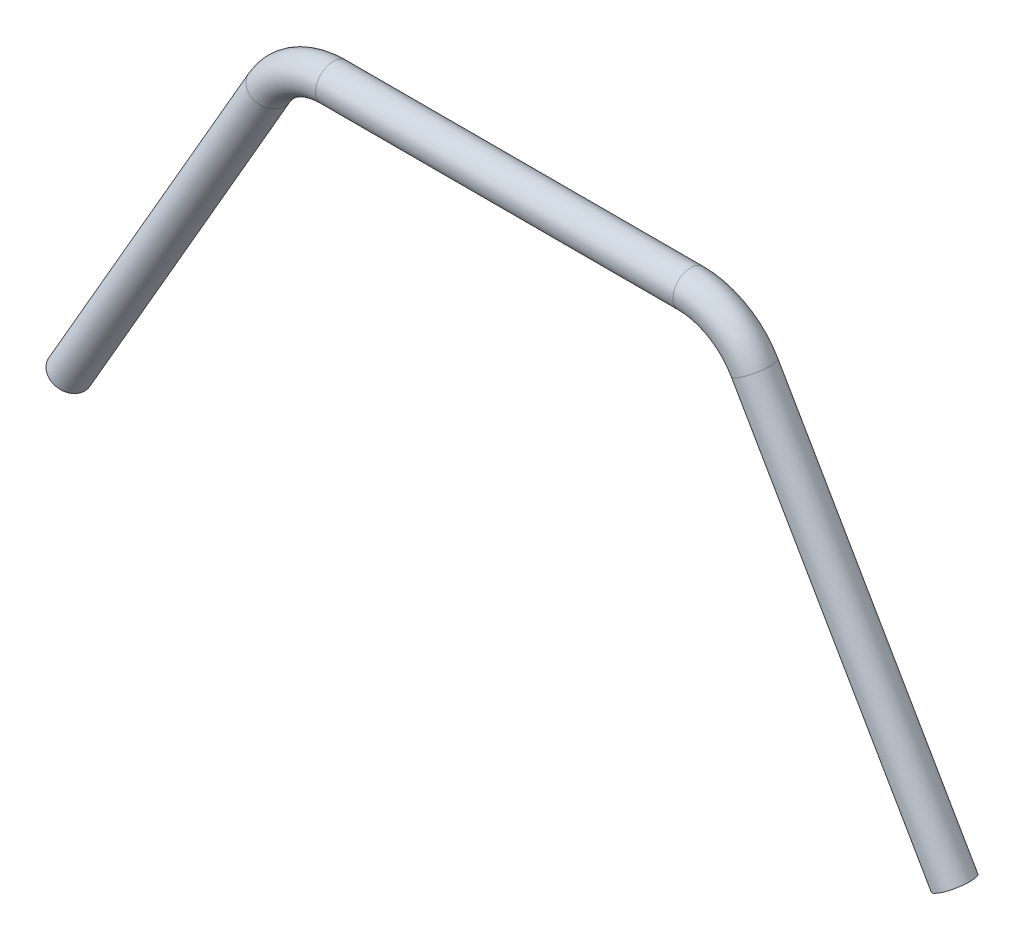
ISO-10303-21;
HEADER;
FILE_DESCRIPTION(('STEP AP214'),'2;1');
FILE_NAME('part.step','',(''),(''),'','','');
FILE_SCHEMA(('AUTOMOTIVE_DESIGN { 1 0 10303 214 1 1 1 1 }'));
ENDSEC;
DATA;
#1=APPLICATION_CONTEXT('core data for automotive mechanical design processes');
#2=APPLICATION_PROTOCOL_DEFINITION('international standard','automotive_design',2000,#1);
#3=PRODUCT_CONTEXT('',#1,'mechanical');
#4=PRODUCT('Part','Part','',(#3));
#5=PRODUCT_RELATED_PRODUCT_CATEGORY('part','',(#4));
#6=PRODUCT_DEFINITION_FORMATION('','',#4);
#7=PRODUCT_DEFINITION_CONTEXT('part definition',#1,'design');
#8=PRODUCT_DEFINITION('design','',#6,#7);
#9=PRODUCT_DEFINITION_SHAPE('','',#8);
#10=(LENGTH_UNIT() NAMED_UNIT(*) SI_UNIT(.MILLI.,.METRE.));
#11=(NAMED_UNIT(*) PLANE_ANGLE_UNIT() SI_UNIT($,.RADIAN.));
#12=(NAMED_UNIT(*) SI_UNIT($,.STERADIAN.) SOLID_ANGLE_UNIT());
#13=UNCERTAINTY_MEASURE_WITH_UNIT(LENGTH_MEASURE(1.E-05),#10,'distance_accuracy_value','');
#14=(GEOMETRIC_REPRESENTATION_CONTEXT(3) GLOBAL_UNCERTAINTY_ASSIGNED_CONTEXT((#13)) GLOBAL_UNIT_ASSIGNED_CONTEXT((#10,
#11,#12)) REPRESENTATION_CONTEXT('',''));
#15=CARTESIAN_POINT('',(0.,0.,0.));
#16=DIRECTION('',(0.,0.,1.));
#17=DIRECTION('',(1.,0.,0.));
#18=AXIS2_PLACEMENT_3D('',#15,#16,#17);
#19=CARTESIAN_POINT('',(150.,-135.903810567666,0.));
#20=DIRECTION('',(0.499999999999998,-0.86602540378444,0.));
#21=DIRECTION('',(0.,0.,-1.));
#22=AXIS2_PLACEMENT_3D('',#19,#20,#21);
#23=PLANE('',#22);
#24=CARTESIAN_POINT('',(150.,-135.903810567666,0.));
#25=DIRECTION('',(0.499999999999998,-0.86602540378444,0.));
#26=DIRECTION('',(0.,0.,-1.));
#27=AXIS2_PLACEMENT_3D('',#24,#25,#26);
#28=CIRCLE('',#27,6.);
#29=CARTESIAN_POINT('',(150.,-135.903810567666,-6.));
#30=VERTEX_POINT('',#29);
#31=EDGE_CURVE('E10',#30,#30,#28,.T.);
#32=ORIENTED_EDGE('',*,*,#31,.T.);
#33=EDGE_LOOP('',(#32));
#34=FACE_BOUND('',#33,.T.);
#35=ADVANCED_FACE('F36',(#34),#23,.T.);
#36=CARTESIAN_POINT('',(0.,-6.,0.));
#37=DIRECTION('',(1.,0.,0.));
#38=DIRECTION('',(0.,1.,0.));
#39=AXIS2_PLACEMENT_3D('',#36,#37,#38);
#40=CYLINDRICAL_SURFACE('',#39,6.);
#41=CARTESIAN_POINT('',(60.5662432702593,-6.,0.));
#42=DIRECTION('',(1.,0.,0.));
#43=DIRECTION('',(0.,0.,-1.));
#44=AXIS2_PLACEMENT_3D('',#41,#42,#43);
#45=CIRCLE('',#44,6.);
#46=CARTESIAN_POINT('',(60.5662432702593,0.,0.));
#47=VERTEX_POINT('',#46);
#48=EDGE_CURVE('E49',#47,#47,#45,.T.);
#49=ORIENTED_EDGE('',*,*,#48,.F.);
#50=EDGE_LOOP('',(#49));
#51=FACE_BOUND('',#50,.T.);
#52=CARTESIAN_POINT('',(-60.5662432702593,-6.,0.));
#53=DIRECTION('',(1.,0.,0.));
#54=DIRECTION('',(0.,0.,-1.));
#55=AXIS2_PLACEMENT_3D('',#52,#53,#54);
#56=CIRCLE('',#55,6.);
#57=CARTESIAN_POINT('',(-60.5662432702593,0.,0.));
#58=VERTEX_POINT('',#57);
#59=EDGE_CURVE('E65',#58,#58,#56,.F.);
#60=ORIENTED_EDGE('',*,*,#59,.F.);
#61=EDGE_LOOP('',(#60));
#62=FACE_BOUND('',#61,.T.);
#63=ADVANCED_FACE('F73',(#51,#62),#40,.T.);
#64=CARTESIAN_POINT('',(60.5662432702593,-31.,0.));
#65=DIRECTION('',(0.,0.,-1.));
#66=DIRECTION('',(-1.,0.,0.));
#67=AXIS2_PLACEMENT_3D('',#64,#65,#66);
#68=TOROIDAL_SURFACE('',#67,25.,6.);
#69=CARTESIAN_POINT('',(82.2168783648703,-18.5000000000001,0.));
#70=DIRECTION('',(0.499999999999998,-0.86602540378444,0.));
#71=DIRECTION('',(0.,0.,-1.));
#72=AXIS2_PLACEMENT_3D('',#69,#70,#71);
#73=CIRCLE('',#72,6.);
#74=CARTESIAN_POINT('',(87.413030787577,-15.5000000000001,0.));
#75=VERTEX_POINT('',#74);
#76=EDGE_CURVE('E43',#75,#75,#73,.T.);
#77=CARTESIAN_POINT('',(60.5662432702593,-31.,0.));
#78=DIRECTION('',(0.,0.,-1.));
#79=DIRECTION('',(-1.,0.,0.));
#80=AXIS2_PLACEMENT_3D('',#77,#78,#79);
#81=CIRCLE('',#80,31.);
#82=EDGE_CURVE('',#47,#75,#81,.T.);
#83=ORIENTED_EDGE('',*,*,#48,.T.);
#84=ORIENTED_EDGE('',*,*,#76,.F.);
#85=ORIENTED_EDGE('',*,*,#82,.T.);
#86=ORIENTED_EDGE('',*,*,#82,.F.);
#87=EDGE_LOOP('',(#83,#85,#84,#86));
#88=FACE_BOUND('',#87,.T.);
#89=ADVANCED_FACE('F75',(#88),#68,.T.);
#90=CARTESIAN_POINT('',(82.2168783648703,-18.5000000000001,0.));
#91=DIRECTION('',(0.499999999999998,-0.86602540378444,0.));
#92=DIRECTION('',(0.86602540378444,0.499999999999998,0.));
#93=AXIS2_PLACEMENT_3D('',#90,#91,#92);
#94=CYLINDRICAL_SURFACE('',#93,6.);
#95=ORIENTED_EDGE('',*,*,#31,.F.);
#96=EDGE_LOOP('',(#95));
#97=FACE_BOUND('',#96,.T.);
#98=ORIENTED_EDGE('',*,*,#76,.T.);
#99=EDGE_LOOP('',(#98));
#100=FACE_BOUND('',#99,.T.);
#101=ADVANCED_FACE('F82',(#97,#100),#94,.T.);
#102=CARTESIAN_POINT('',(-150.,-135.903810567666,0.));
#103=DIRECTION('',(-0.499999999999998,-0.86602540378444,0.));
#104=DIRECTION('',(0.,0.,-1.));
#105=AXIS2_PLACEMENT_3D('',#102,#103,#104);
#106=PLANE('',#105);
#107=CARTESIAN_POINT('',(-150.,-135.903810567666,0.));
#108=DIRECTION('',(0.499999999999998,0.86602540378444,0.));
#109=DIRECTION('',(0.,0.,-1.));
#110=AXIS2_PLACEMENT_3D('',#107,#108,#109);
#111=CIRCLE('',#110,6.);
#112=CARTESIAN_POINT('',(-150.,-135.903810567666,-6.));
#113=VERTEX_POINT('',#112);
#114=EDGE_CURVE('E55',#113,#113,#111,.F.);
#115=ORIENTED_EDGE('',*,*,#114,.T.);
#116=EDGE_LOOP('',(#115));
#117=FACE_BOUND('',#116,.T.);
#118=ADVANCED_FACE('F89',(#117),#106,.T.);
#119=CARTESIAN_POINT('',(-60.5662432702593,-31.,0.));
#120=DIRECTION('',(0.,0.,1.));
#121=DIRECTION('',(1.,0.,0.));
#122=AXIS2_PLACEMENT_3D('',#119,#120,#121);
#123=TOROIDAL_SURFACE('',#122,25.,6.);
#124=CARTESIAN_POINT('',(-82.2168783648703,-18.5000000000001,0.));
#125=DIRECTION('',(0.499999999999998,0.86602540378444,0.));
#126=DIRECTION('',(0.,0.,-1.));
#127=AXIS2_PLACEMENT_3D('',#124,#125,#126);
#128=CIRCLE('',#127,6.);
#129=CARTESIAN_POINT('',(-87.413030787577,-15.5000000000001,0.));
#130=VERTEX_POINT('',#129);
#131=EDGE_CURVE('E61',#130,#130,#128,.F.);
#132=CARTESIAN_POINT('',(-60.5662432702593,-31.,0.));
#133=DIRECTION('',(0.,0.,1.));
#134=DIRECTION('',(1.,0.,0.));
#135=AXIS2_PLACEMENT_3D('',#132,#133,#134);
#136=CIRCLE('',#135,31.);
#137=EDGE_CURVE('',#58,#130,#136,.T.);
#138=ORIENTED_EDGE('',*,*,#59,.T.);
#139=ORIENTED_EDGE('',*,*,#131,.F.);
#140=ORIENTED_EDGE('',*,*,#137,.T.);
#141=ORIENTED_EDGE('',*,*,#137,.F.);
#142=EDGE_LOOP('',(#138,#140,#139,#141));
#143=FACE_BOUND('',#142,.T.);
#144=ADVANCED_FACE('F71',(#143),#123,.T.);
#145=CARTESIAN_POINT('',(-82.2168783648703,-18.5000000000001,0.));
#146=DIRECTION('',(-0.499999999999998,-0.86602540378444,0.));
#147=DIRECTION('',(0.86602540378444,-0.499999999999998,0.));
#148=AXIS2_PLACEMENT_3D('',#145,#146,#147);
#149=CYLINDRICAL_SURFACE('',#148,6.);
#150=ORIENTED_EDGE('',*,*,#114,.F.);
#151=EDGE_LOOP('',(#150));
#152=FACE_BOUND('',#151,.T.);
#153=ORIENTED_EDGE('',*,*,#131,.T.);
#154=EDGE_LOOP('',(#153));
#155=FACE_BOUND('',#154,.T.);
#156=ADVANCED_FACE('F85',(#152,#155),#149,.T.);
#157=CLOSED_SHELL('',(#35,#63,#89,#101,#118,#144,#156));
#158=MANIFOLD_SOLID_BREP('B2',#157);
#159=ADVANCED_BREP_SHAPE_REPRESENTATION('',(#18,#158),#14);
#160=SHAPE_DEFINITION_REPRESENTATION(#9,#159);
ENDSEC;
END-ISO-10303-21;
